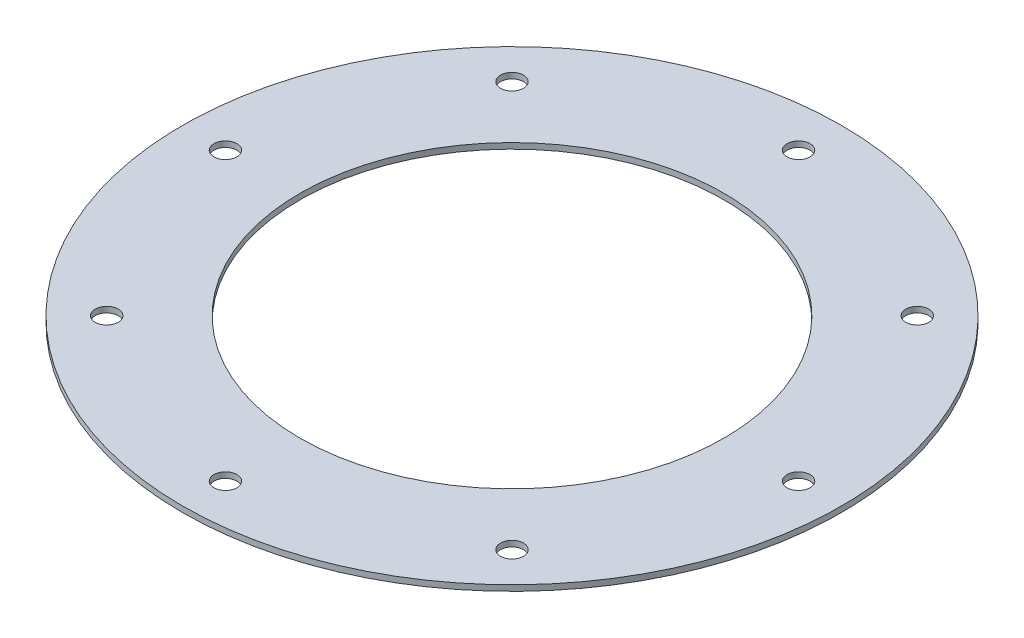
ISO-10303-21;
HEADER;
FILE_DESCRIPTION(('STEP AP214'),'2;1');
FILE_NAME('part.step','',(''),(''),'','','');
FILE_SCHEMA(('AUTOMOTIVE_DESIGN { 1 0 10303 214 1 1 1 1 }'));
ENDSEC;
DATA;
#1=APPLICATION_CONTEXT('core data for automotive mechanical design processes');
#2=APPLICATION_PROTOCOL_DEFINITION('international standard','automotive_design',2000,#1);
#3=PRODUCT_CONTEXT('',#1,'mechanical');
#4=PRODUCT('Part','Part','',(#3));
#5=PRODUCT_RELATED_PRODUCT_CATEGORY('part','',(#4));
#6=PRODUCT_DEFINITION_FORMATION('','',#4);
#7=PRODUCT_DEFINITION_CONTEXT('part definition',#1,'design');
#8=PRODUCT_DEFINITION('design','',#6,#7);
#9=PRODUCT_DEFINITION_SHAPE('','',#8);
#10=(LENGTH_UNIT() NAMED_UNIT(*) SI_UNIT(.MILLI.,.METRE.));
#11=(NAMED_UNIT(*) PLANE_ANGLE_UNIT() SI_UNIT($,.RADIAN.));
#12=(NAMED_UNIT(*) SI_UNIT($,.STERADIAN.) SOLID_ANGLE_UNIT());
#13=UNCERTAINTY_MEASURE_WITH_UNIT(LENGTH_MEASURE(1.E-05),#10,'distance_accuracy_value','');
#14=(GEOMETRIC_REPRESENTATION_CONTEXT(3) GLOBAL_UNCERTAINTY_ASSIGNED_CONTEXT((#13)) GLOBAL_UNIT_ASSIGNED_CONTEXT((#10,
#11,#12)) REPRESENTATION_CONTEXT('',''));
#15=CARTESIAN_POINT('',(0.,0.,0.));
#16=DIRECTION('',(0.,0.,1.));
#17=DIRECTION('',(1.,0.,0.));
#18=AXIS2_PLACEMENT_3D('',#15,#16,#17);
#19=CARTESIAN_POINT('',(0.,2.,0.));
#20=DIRECTION('',(0.,1.,0.));
#21=DIRECTION('',(0.,0.,1.));
#22=AXIS2_PLACEMENT_3D('',#19,#20,#21);
#23=PLANE('',#22);
#24=CARTESIAN_POINT('',(0.,2.,100.));
#25=DIRECTION('',(0.,1.,0.));
#26=DIRECTION('',(0.,0.,1.));
#27=AXIS2_PLACEMENT_3D('',#24,#25,#26);
#28=CIRCLE('',#27,4.00000000000001);
#29=CARTESIAN_POINT('',(0.,2.,104.));
#30=VERTEX_POINT('',#29);
#31=EDGE_CURVE('E84',#30,#30,#28,.T.);
#32=ORIENTED_EDGE('',*,*,#31,.F.);
#33=EDGE_LOOP('',(#32));
#34=FACE_BOUND('',#33,.T.);
#35=CARTESIAN_POINT('',(100.,2.,0.));
#36=DIRECTION('',(0.,1.,0.));
#37=DIRECTION('',(0.,0.,1.));
#38=AXIS2_PLACEMENT_3D('',#35,#36,#37);
#39=CIRCLE('',#38,4.00000000000002);
#40=CARTESIAN_POINT('',(100.,2.,3.99999999999999));
#41=VERTEX_POINT('',#40);
#42=EDGE_CURVE('E72',#41,#41,#39,.T.);
#43=ORIENTED_EDGE('',*,*,#42,.F.);
#44=EDGE_LOOP('',(#43));
#45=FACE_BOUND('',#44,.T.);
#46=CARTESIAN_POINT('',(0.,2.,-100.));
#47=DIRECTION('',(0.,1.,0.));
#48=DIRECTION('',(0.,0.,1.));
#49=AXIS2_PLACEMENT_3D('',#46,#47,#48);
#50=CIRCLE('',#49,4.);
#51=CARTESIAN_POINT('',(0.,2.,-96.));
#52=VERTEX_POINT('',#51);
#53=EDGE_CURVE('E60',#52,#52,#50,.T.);
#54=ORIENTED_EDGE('',*,*,#53,.F.);
#55=EDGE_LOOP('',(#54));
#56=FACE_BOUND('',#55,.T.);
#57=CARTESIAN_POINT('',(-100.,2.,0.));
#58=DIRECTION('',(0.,1.,0.));
#59=DIRECTION('',(0.,0.,1.));
#60=AXIS2_PLACEMENT_3D('',#57,#58,#59);
#61=CIRCLE('',#60,4.00000000000001);
#62=CARTESIAN_POINT('',(-100.,2.,4.00000000000002));
#63=VERTEX_POINT('',#62);
#64=EDGE_CURVE('E48',#63,#63,#61,.T.);
#65=ORIENTED_EDGE('',*,*,#64,.F.);
#66=EDGE_LOOP('',(#65));
#67=FACE_BOUND('',#66,.T.);
#68=CARTESIAN_POINT('',(0.,2.,0.));
#69=DIRECTION('',(0.,1.,0.));
#70=DIRECTION('',(0.,0.,1.));
#71=AXIS2_PLACEMENT_3D('',#68,#69,#70);
#72=CIRCLE('',#71,115.);
#73=CARTESIAN_POINT('',(0.,2.,115.));
#74=VERTEX_POINT('',#73);
#75=EDGE_CURVE('E10',#74,#74,#72,.T.);
#76=ORIENTED_EDGE('',*,*,#75,.T.);
#77=EDGE_LOOP('',(#76));
#78=FACE_BOUND('',#77,.T.);
#79=CARTESIAN_POINT('',(0.,2.,0.));
#80=DIRECTION('',(0.,1.,0.));
#81=DIRECTION('',(0.,0.,1.));
#82=AXIS2_PLACEMENT_3D('',#79,#80,#81);
#83=CIRCLE('',#82,74.);
#84=CARTESIAN_POINT('',(0.,2.,74.));
#85=VERTEX_POINT('',#84);
#86=EDGE_CURVE('E43',#85,#85,#83,.T.);
#87=ORIENTED_EDGE('',*,*,#86,.F.);
#88=EDGE_LOOP('',(#87));
#89=FACE_BOUND('',#88,.T.);
#90=CARTESIAN_POINT('',(-70.7106781186548,2.,-70.7106781186548));
#91=DIRECTION('',(0.,1.,0.));
#92=DIRECTION('',(0.,0.,1.));
#93=AXIS2_PLACEMENT_3D('',#90,#91,#92);
#94=CIRCLE('',#93,4.00000000000001);
#95=CARTESIAN_POINT('',(-70.7106781186548,2.,-66.7106781186548));
#96=VERTEX_POINT('',#95);
#97=EDGE_CURVE('E54',#96,#96,#94,.T.);
#98=ORIENTED_EDGE('',*,*,#97,.F.);
#99=EDGE_LOOP('',(#98));
#100=FACE_BOUND('',#99,.T.);
#101=CARTESIAN_POINT('',(70.7106781186547,2.,-70.7106781186548));
#102=DIRECTION('',(0.,1.,0.));
#103=DIRECTION('',(0.,0.,1.));
#104=AXIS2_PLACEMENT_3D('',#101,#102,#103);
#105=CIRCLE('',#104,4.00000000000001);
#106=CARTESIAN_POINT('',(70.7106781186547,2.,-66.7106781186548));
#107=VERTEX_POINT('',#106);
#108=EDGE_CURVE('E66',#107,#107,#105,.T.);
#109=ORIENTED_EDGE('',*,*,#108,.F.);
#110=EDGE_LOOP('',(#109));
#111=FACE_BOUND('',#110,.T.);
#112=CARTESIAN_POINT('',(70.7106781186548,2.,70.7106781186547));
#113=DIRECTION('',(0.,1.,0.));
#114=DIRECTION('',(0.,0.,1.));
#115=AXIS2_PLACEMENT_3D('',#112,#113,#114);
#116=CIRCLE('',#115,4.00000000000002);
#117=CARTESIAN_POINT('',(70.7106781186548,2.,74.7106781186548));
#118=VERTEX_POINT('',#117);
#119=EDGE_CURVE('E78',#118,#118,#116,.T.);
#120=ORIENTED_EDGE('',*,*,#119,.F.);
#121=EDGE_LOOP('',(#120));
#122=FACE_BOUND('',#121,.T.);
#123=CARTESIAN_POINT('',(-70.7106781186547,2.,70.7106781186548));
#124=DIRECTION('',(0.,1.,0.));
#125=DIRECTION('',(0.,0.,1.));
#126=AXIS2_PLACEMENT_3D('',#123,#124,#125);
#127=CIRCLE('',#126,4.00000000000001);
#128=CARTESIAN_POINT('',(-70.7106781186547,2.,74.7106781186548));
#129=VERTEX_POINT('',#128);
#130=EDGE_CURVE('E90',#129,#129,#127,.T.);
#131=ORIENTED_EDGE('',*,*,#130,.F.);
#132=EDGE_LOOP('',(#131));
#133=FACE_BOUND('',#132,.T.);
#134=ADVANCED_FACE('F32',(#34,#45,#56,#67,#78,#89,#100,#111,#122,#133),#23,.T.);
#135=CARTESIAN_POINT('',(0.,0.,0.));
#136=DIRECTION('',(0.,1.,0.));
#137=DIRECTION('',(0.,0.,1.));
#138=AXIS2_PLACEMENT_3D('',#135,#136,#137);
#139=PLANE('',#138);
#140=CARTESIAN_POINT('',(0.,0.,0.));
#141=DIRECTION('',(0.,1.,0.));
#142=DIRECTION('',(0.,0.,1.));
#143=AXIS2_PLACEMENT_3D('',#140,#141,#142);
#144=CIRCLE('',#143,115.);
#145=CARTESIAN_POINT('',(0.,0.,115.));
#146=VERTEX_POINT('',#145);
#147=EDGE_CURVE('E36',#146,#146,#144,.T.);
#148=ORIENTED_EDGE('',*,*,#147,.F.);
#149=EDGE_LOOP('',(#148));
#150=FACE_BOUND('',#149,.T.);
#151=CARTESIAN_POINT('',(0.,0.,0.));
#152=DIRECTION('',(0.,1.,0.));
#153=DIRECTION('',(0.,0.,1.));
#154=AXIS2_PLACEMENT_3D('',#151,#152,#153);
#155=CIRCLE('',#154,74.);
#156=CARTESIAN_POINT('',(0.,0.,74.));
#157=VERTEX_POINT('',#156);
#158=EDGE_CURVE('E45',#157,#157,#155,.T.);
#159=ORIENTED_EDGE('',*,*,#158,.T.);
#160=EDGE_LOOP('',(#159));
#161=FACE_BOUND('',#160,.T.);
#162=CARTESIAN_POINT('',(-100.,0.,0.));
#163=DIRECTION('',(0.,1.,0.));
#164=DIRECTION('',(0.,0.,1.));
#165=AXIS2_PLACEMENT_3D('',#162,#163,#164);
#166=CIRCLE('',#165,4.00000000000001);
#167=CARTESIAN_POINT('',(-100.,0.,4.00000000000002));
#168=VERTEX_POINT('',#167);
#169=EDGE_CURVE('E51',#168,#168,#166,.T.);
#170=ORIENTED_EDGE('',*,*,#169,.T.);
#171=EDGE_LOOP('',(#170));
#172=FACE_BOUND('',#171,.T.);
#173=CARTESIAN_POINT('',(-70.7106781186548,0.,-70.7106781186548));
#174=DIRECTION('',(0.,1.,0.));
#175=DIRECTION('',(0.,0.,1.));
#176=AXIS2_PLACEMENT_3D('',#173,#174,#175);
#177=CIRCLE('',#176,4.00000000000001);
#178=CARTESIAN_POINT('',(-70.7106781186548,0.,-66.7106781186548));
#179=VERTEX_POINT('',#178);
#180=EDGE_CURVE('E57',#179,#179,#177,.T.);
#181=ORIENTED_EDGE('',*,*,#180,.T.);
#182=EDGE_LOOP('',(#181));
#183=FACE_BOUND('',#182,.T.);
#184=CARTESIAN_POINT('',(0.,0.,-100.));
#185=DIRECTION('',(0.,1.,0.));
#186=DIRECTION('',(0.,0.,1.));
#187=AXIS2_PLACEMENT_3D('',#184,#185,#186);
#188=CIRCLE('',#187,4.);
#189=CARTESIAN_POINT('',(0.,0.,-96.));
#190=VERTEX_POINT('',#189);
#191=EDGE_CURVE('E63',#190,#190,#188,.T.);
#192=ORIENTED_EDGE('',*,*,#191,.T.);
#193=EDGE_LOOP('',(#192));
#194=FACE_BOUND('',#193,.T.);
#195=CARTESIAN_POINT('',(70.7106781186547,0.,-70.7106781186548));
#196=DIRECTION('',(0.,1.,0.));
#197=DIRECTION('',(0.,0.,1.));
#198=AXIS2_PLACEMENT_3D('',#195,#196,#197);
#199=CIRCLE('',#198,4.00000000000001);
#200=CARTESIAN_POINT('',(70.7106781186547,0.,-66.7106781186548));
#201=VERTEX_POINT('',#200);
#202=EDGE_CURVE('E69',#201,#201,#199,.T.);
#203=ORIENTED_EDGE('',*,*,#202,.T.);
#204=EDGE_LOOP('',(#203));
#205=FACE_BOUND('',#204,.T.);
#206=CARTESIAN_POINT('',(100.,0.,0.));
#207=DIRECTION('',(0.,1.,0.));
#208=DIRECTION('',(0.,0.,1.));
#209=AXIS2_PLACEMENT_3D('',#206,#207,#208);
#210=CIRCLE('',#209,4.00000000000002);
#211=CARTESIAN_POINT('',(100.,0.,3.99999999999999));
#212=VERTEX_POINT('',#211);
#213=EDGE_CURVE('E75',#212,#212,#210,.T.);
#214=ORIENTED_EDGE('',*,*,#213,.T.);
#215=EDGE_LOOP('',(#214));
#216=FACE_BOUND('',#215,.T.);
#217=CARTESIAN_POINT('',(70.7106781186548,0.,70.7106781186547));
#218=DIRECTION('',(0.,1.,0.));
#219=DIRECTION('',(0.,0.,1.));
#220=AXIS2_PLACEMENT_3D('',#217,#218,#219);
#221=CIRCLE('',#220,4.00000000000002);
#222=CARTESIAN_POINT('',(70.7106781186548,0.,74.7106781186548));
#223=VERTEX_POINT('',#222);
#224=EDGE_CURVE('E81',#223,#223,#221,.T.);
#225=ORIENTED_EDGE('',*,*,#224,.T.);
#226=EDGE_LOOP('',(#225));
#227=FACE_BOUND('',#226,.T.);
#228=CARTESIAN_POINT('',(0.,0.,100.));
#229=DIRECTION('',(0.,1.,0.));
#230=DIRECTION('',(0.,0.,1.));
#231=AXIS2_PLACEMENT_3D('',#228,#229,#230);
#232=CIRCLE('',#231,4.00000000000001);
#233=CARTESIAN_POINT('',(0.,0.,104.));
#234=VERTEX_POINT('',#233);
#235=EDGE_CURVE('E87',#234,#234,#232,.T.);
#236=ORIENTED_EDGE('',*,*,#235,.T.);
#237=EDGE_LOOP('',(#236));
#238=FACE_BOUND('',#237,.T.);
#239=CARTESIAN_POINT('',(-70.7106781186547,0.,70.7106781186548));
#240=DIRECTION('',(0.,1.,0.));
#241=DIRECTION('',(0.,0.,1.));
#242=AXIS2_PLACEMENT_3D('',#239,#240,#241);
#243=CIRCLE('',#242,4.00000000000001);
#244=CARTESIAN_POINT('',(-70.7106781186547,0.,74.7106781186548));
#245=VERTEX_POINT('',#244);
#246=EDGE_CURVE('E93',#245,#245,#243,.T.);
#247=ORIENTED_EDGE('',*,*,#246,.T.);
#248=EDGE_LOOP('',(#247));
#249=FACE_BOUND('',#248,.T.);
#250=ADVANCED_FACE('F103',(#150,#161,#172,#183,#194,#205,#216,#227,#238,#249),#139,.F.);
#251=CARTESIAN_POINT('',(0.,2.,0.));
#252=DIRECTION('',(0.,-1.,0.));
#253=DIRECTION('',(0.,0.,-1.));
#254=AXIS2_PLACEMENT_3D('',#251,#252,#253);
#255=CYLINDRICAL_SURFACE('',#254,115.);
#256=ORIENTED_EDGE('',*,*,#75,.F.);
#257=EDGE_LOOP('',(#256));
#258=FACE_BOUND('',#257,.T.);
#259=ORIENTED_EDGE('',*,*,#147,.T.);
#260=EDGE_LOOP('',(#259));
#261=FACE_BOUND('',#260,.T.);
#262=ADVANCED_FACE('F34',(#258,#261),#255,.T.);
#263=CARTESIAN_POINT('',(0.,2.,0.));
#264=DIRECTION('',(0.,-1.,0.));
#265=DIRECTION('',(0.,0.,-1.));
#266=AXIS2_PLACEMENT_3D('',#263,#264,#265);
#267=CYLINDRICAL_SURFACE('',#266,74.);
#268=ORIENTED_EDGE('',*,*,#86,.T.);
#269=EDGE_LOOP('',(#268));
#270=FACE_BOUND('',#269,.T.);
#271=ORIENTED_EDGE('',*,*,#158,.F.);
#272=EDGE_LOOP('',(#271));
#273=FACE_BOUND('',#272,.T.);
#274=ADVANCED_FACE('F113',(#270,#273),#267,.F.);
#275=CARTESIAN_POINT('',(-100.,2.,0.));
#276=DIRECTION('',(0.,-1.,0.));
#277=DIRECTION('',(0.,0.,-1.));
#278=AXIS2_PLACEMENT_3D('',#275,#276,#277);
#279=CYLINDRICAL_SURFACE('',#278,4.00000000000001);
#280=ORIENTED_EDGE('',*,*,#64,.T.);
#281=EDGE_LOOP('',(#280));
#282=FACE_BOUND('',#281,.T.);
#283=ORIENTED_EDGE('',*,*,#169,.F.);
#284=EDGE_LOOP('',(#283));
#285=FACE_BOUND('',#284,.T.);
#286=ADVANCED_FACE('F116',(#282,#285),#279,.F.);
#287=CARTESIAN_POINT('',(-70.7106781186548,2.,-70.7106781186548));
#288=DIRECTION('',(0.,-1.,0.));
#289=DIRECTION('',(0.,0.,-1.));
#290=AXIS2_PLACEMENT_3D('',#287,#288,#289);
#291=CYLINDRICAL_SURFACE('',#290,4.00000000000001);
#292=ORIENTED_EDGE('',*,*,#97,.T.);
#293=EDGE_LOOP('',(#292));
#294=FACE_BOUND('',#293,.T.);
#295=ORIENTED_EDGE('',*,*,#180,.F.);
#296=EDGE_LOOP('',(#295));
#297=FACE_BOUND('',#296,.T.);
#298=ADVANCED_FACE('F120',(#294,#297),#291,.F.);
#299=CARTESIAN_POINT('',(0.,2.,-100.));
#300=DIRECTION('',(0.,-1.,0.));
#301=DIRECTION('',(0.,0.,-1.));
#302=AXIS2_PLACEMENT_3D('',#299,#300,#301);
#303=CYLINDRICAL_SURFACE('',#302,4.);
#304=ORIENTED_EDGE('',*,*,#53,.T.);
#305=EDGE_LOOP('',(#304));
#306=FACE_BOUND('',#305,.T.);
#307=ORIENTED_EDGE('',*,*,#191,.F.);
#308=EDGE_LOOP('',(#307));
#309=FACE_BOUND('',#308,.T.);
#310=ADVANCED_FACE('F124',(#306,#309),#303,.F.);
#311=CARTESIAN_POINT('',(70.7106781186547,2.,-70.7106781186548));
#312=DIRECTION('',(0.,-1.,0.));
#313=DIRECTION('',(0.,0.,-1.));
#314=AXIS2_PLACEMENT_3D('',#311,#312,#313);
#315=CYLINDRICAL_SURFACE('',#314,4.00000000000001);
#316=ORIENTED_EDGE('',*,*,#108,.T.);
#317=EDGE_LOOP('',(#316));
#318=FACE_BOUND('',#317,.T.);
#319=ORIENTED_EDGE('',*,*,#202,.F.);
#320=EDGE_LOOP('',(#319));
#321=FACE_BOUND('',#320,.T.);
#322=ADVANCED_FACE('F128',(#318,#321),#315,.F.);
#323=CARTESIAN_POINT('',(100.,2.,0.));
#324=DIRECTION('',(0.,-1.,0.));
#325=DIRECTION('',(0.,0.,-1.));
#326=AXIS2_PLACEMENT_3D('',#323,#324,#325);
#327=CYLINDRICAL_SURFACE('',#326,4.00000000000002);
#328=ORIENTED_EDGE('',*,*,#42,.T.);
#329=EDGE_LOOP('',(#328));
#330=FACE_BOUND('',#329,.T.);
#331=ORIENTED_EDGE('',*,*,#213,.F.);
#332=EDGE_LOOP('',(#331));
#333=FACE_BOUND('',#332,.T.);
#334=ADVANCED_FACE('F132',(#330,#333),#327,.F.);
#335=CARTESIAN_POINT('',(70.7106781186548,2.,70.7106781186547));
#336=DIRECTION('',(0.,-1.,0.));
#337=DIRECTION('',(0.,0.,-1.));
#338=AXIS2_PLACEMENT_3D('',#335,#336,#337);
#339=CYLINDRICAL_SURFACE('',#338,4.00000000000002);
#340=ORIENTED_EDGE('',*,*,#119,.T.);
#341=EDGE_LOOP('',(#340));
#342=FACE_BOUND('',#341,.T.);
#343=ORIENTED_EDGE('',*,*,#224,.F.);
#344=EDGE_LOOP('',(#343));
#345=FACE_BOUND('',#344,.T.);
#346=ADVANCED_FACE('F136',(#342,#345),#339,.F.);
#347=CARTESIAN_POINT('',(0.,2.,100.));
#348=DIRECTION('',(0.,-1.,0.));
#349=DIRECTION('',(0.,0.,-1.));
#350=AXIS2_PLACEMENT_3D('',#347,#348,#349);
#351=CYLINDRICAL_SURFACE('',#350,4.00000000000001);
#352=ORIENTED_EDGE('',*,*,#31,.T.);
#353=EDGE_LOOP('',(#352));
#354=FACE_BOUND('',#353,.T.);
#355=ORIENTED_EDGE('',*,*,#235,.F.);
#356=EDGE_LOOP('',(#355));
#357=FACE_BOUND('',#356,.T.);
#358=ADVANCED_FACE('F140',(#354,#357),#351,.F.);
#359=CARTESIAN_POINT('',(-70.7106781186547,2.,70.7106781186548));
#360=DIRECTION('',(0.,-1.,0.));
#361=DIRECTION('',(0.,0.,-1.));
#362=AXIS2_PLACEMENT_3D('',#359,#360,#361);
#363=CYLINDRICAL_SURFACE('',#362,4.00000000000001);
#364=ORIENTED_EDGE('',*,*,#130,.T.);
#365=EDGE_LOOP('',(#364));
#366=FACE_BOUND('',#365,.T.);
#367=ORIENTED_EDGE('',*,*,#246,.F.);
#368=EDGE_LOOP('',(#367));
#369=FACE_BOUND('',#368,.T.);
#370=ADVANCED_FACE('F99',(#366,#369),#363,.F.);
#371=CLOSED_SHELL('',(#134,#250,#262,#274,#286,#298,#310,#322,#334,#346,#358,#370));
#372=MANIFOLD_SOLID_BREP('B2',#371);
#373=ADVANCED_BREP_SHAPE_REPRESENTATION('',(#18,#372),#14);
#374=SHAPE_DEFINITION_REPRESENTATION(#9,#373);
ENDSEC;
END-ISO-10303-21;
